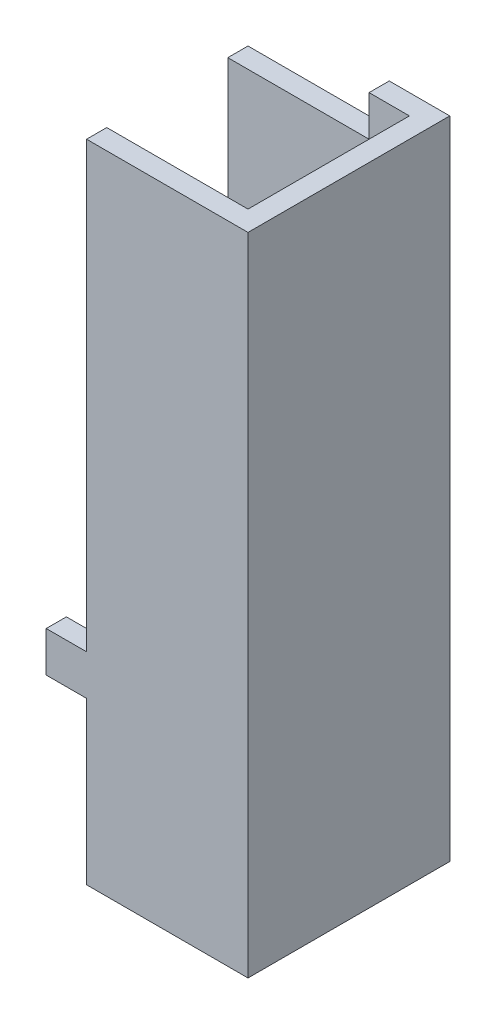
ISO-10303-21;
HEADER;
FILE_DESCRIPTION(('STEP AP214'),'2;1');
FILE_NAME('part.step','',(''),(''),'','','');
FILE_SCHEMA(('AUTOMOTIVE_DESIGN { 1 0 10303 214 1 1 1 1 }'));
ENDSEC;
DATA;
#1=APPLICATION_CONTEXT('core data for automotive mechanical design processes');
#2=APPLICATION_PROTOCOL_DEFINITION('international standard','automotive_design',2000,#1);
#3=PRODUCT_CONTEXT('',#1,'mechanical');
#4=PRODUCT('Part','Part','',(#3));
#5=PRODUCT_RELATED_PRODUCT_CATEGORY('part','',(#4));
#6=PRODUCT_DEFINITION_FORMATION('','',#4);
#7=PRODUCT_DEFINITION_CONTEXT('part definition',#1,'design');
#8=PRODUCT_DEFINITION('design','',#6,#7);
#9=PRODUCT_DEFINITION_SHAPE('','',#8);
#10=(LENGTH_UNIT() NAMED_UNIT(*) SI_UNIT(.MILLI.,.METRE.));
#11=(NAMED_UNIT(*) PLANE_ANGLE_UNIT() SI_UNIT($,.RADIAN.));
#12=(NAMED_UNIT(*) SI_UNIT($,.STERADIAN.) SOLID_ANGLE_UNIT());
#13=UNCERTAINTY_MEASURE_WITH_UNIT(LENGTH_MEASURE(1.E-05),#10,'distance_accuracy_value','');
#14=(GEOMETRIC_REPRESENTATION_CONTEXT(3) GLOBAL_UNCERTAINTY_ASSIGNED_CONTEXT((#13)) GLOBAL_UNIT_ASSIGNED_CONTEXT((#10,
#11,#12)) REPRESENTATION_CONTEXT('',''));
#15=CARTESIAN_POINT('',(0.,0.,0.));
#16=DIRECTION('',(0.,0.,1.));
#17=DIRECTION('',(1.,0.,0.));
#18=AXIS2_PLACEMENT_3D('',#15,#16,#17);
#19=CARTESIAN_POINT('',(-1.6,-0.8,0.));
#20=DIRECTION('',(0.,-1.,0.));
#21=DIRECTION('',(0.,0.,-1.));
#22=AXIS2_PLACEMENT_3D('',#19,#20,#21);
#23=PLANE('',#22);
#24=DIRECTION('',(0.,0.,-1.));
#25=VECTOR('',#24,1.);
#26=CARTESIAN_POINT('',(1.45000000001,-0.80000000001,0.));
#27=LINE('',#26,#25);
#28=CARTESIAN_POINT('',(1.45,-0.8,0.05));
#29=VERTEX_POINT('',#28);
#30=CARTESIAN_POINT('',(1.45,-0.8,0.));
#31=VERTEX_POINT('',#30);
#32=EDGE_CURVE('E229',#29,#31,#27,.T.);
#33=ORIENTED_EDGE('',*,*,#32,.T.);
#34=DIRECTION('',(1.,0.,0.));
#35=VECTOR('',#34,1.);
#36=CARTESIAN_POINT('',(-1.60000000001,-0.80000000001,0.));
#37=LINE('',#36,#35);
#38=CARTESIAN_POINT('',(1.6,-0.8,0.));
#39=VERTEX_POINT('',#38);
#40=EDGE_CURVE('E336',#31,#39,#37,.T.);
#41=ORIENTED_EDGE('',*,*,#40,.T.);
#42=DIRECTION('',(0.,0.,1.));
#43=VECTOR('',#42,1.);
#44=CARTESIAN_POINT('',(1.60000000001,-0.80000000001,0.));
#45=LINE('',#44,#43);
#46=CARTESIAN_POINT('',(1.6,-0.8,0.5));
#47=VERTEX_POINT('',#46);
#48=EDGE_CURVE('E266',#39,#47,#45,.T.);
#49=ORIENTED_EDGE('',*,*,#48,.T.);
#50=DIRECTION('',(1.,0.,0.));
#51=VECTOR('',#50,1.);
#52=CARTESIAN_POINT('',(-1.60000000001,-0.80000000001,0.50000000001));
#53=LINE('',#52,#51);
#54=CARTESIAN_POINT('',(1.2,-0.8,0.5));
#55=VERTEX_POINT('',#54);
#56=EDGE_CURVE('E290',#55,#47,#53,.T.);
#57=ORIENTED_EDGE('',*,*,#56,.F.);
#58=DIRECTION('',(0.,0.,-1.));
#59=VECTOR('',#58,1.);
#60=CARTESIAN_POINT('',(1.20000000001,-0.80000000001,0.25000000001));
#61=LINE('',#60,#59);
#62=CARTESIAN_POINT('',(1.2,-0.8,0.45));
#63=VERTEX_POINT('',#62);
#64=EDGE_CURVE('E319',#55,#63,#61,.T.);
#65=ORIENTED_EDGE('',*,*,#64,.T.);
#66=DIRECTION('',(1.,0.,0.));
#67=VECTOR('',#66,1.);
#68=CARTESIAN_POINT('',(-0.02500000001,-0.80000000001,0.45000000001));
#69=LINE('',#68,#67);
#70=CARTESIAN_POINT('',(1.55,-0.8,0.45));
#71=VERTEX_POINT('',#70);
#72=EDGE_CURVE('E11',#63,#71,#69,.T.);
#73=ORIENTED_EDGE('',*,*,#72,.T.);
#74=DIRECTION('',(0.,0.,-1.));
#75=VECTOR('',#74,1.);
#76=CARTESIAN_POINT('',(1.55000000001,-0.80000000001,0.02500000001));
#77=LINE('',#76,#75);
#78=CARTESIAN_POINT('',(1.55,-0.8,0.05));
#79=VERTEX_POINT('',#78);
#80=EDGE_CURVE('E339',#71,#79,#77,.T.);
#81=ORIENTED_EDGE('',*,*,#80,.T.);
#82=DIRECTION('',(-1.,0.,0.));
#83=VECTOR('',#82,1.);
#84=CARTESIAN_POINT('',(-1.57500000001,-0.80000000001,0.05000000001));
#85=LINE('',#84,#83);
#86=EDGE_CURVE('E262',#79,#29,#85,.T.);
#87=ORIENTED_EDGE('',*,*,#86,.T.);
#88=EDGE_LOOP('',(#33,#41,#49,#57,#65,#73,#81,#87));
#89=FACE_BOUND('',#88,.T.);
#90=ADVANCED_FACE('F17',(#89),#23,.T.);
#91=CARTESIAN_POINT('',(1.1,-0.8,-0.448729564886));
#92=DIRECTION('',(1.,0.,0.));
#93=DIRECTION('',(0.,1.,0.));
#94=AXIS2_PLACEMENT_3D('',#91,#92,#93);
#95=PLANE('',#94);
#96=DIRECTION('',(0.,0.,-1.));
#97=VECTOR('',#96,1.);
#98=CARTESIAN_POINT('',(1.10000000001,-0.30000000001,0.02563521756698));
#99=LINE('',#98,#97);
#100=CARTESIAN_POINT('',(1.1,-0.3,0.5));
#101=VERTEX_POINT('',#100);
#102=CARTESIAN_POINT('',(1.1,-0.3,0.45));
#103=VERTEX_POINT('',#102);
#104=EDGE_CURVE('E217',#101,#103,#99,.T.);
#105=ORIENTED_EDGE('',*,*,#104,.T.);
#106=DIRECTION('',(0.,-1.,0.));
#107=VECTOR('',#106,1.);
#108=CARTESIAN_POINT('',(1.10000000001,-0.80000000001,0.45000000001));
#109=LINE('',#108,#107);
#110=CARTESIAN_POINT('',(1.1,-0.4,0.45));
#111=VERTEX_POINT('',#110);
#112=EDGE_CURVE('E202',#103,#111,#109,.T.);
#113=ORIENTED_EDGE('',*,*,#112,.T.);
#114=DIRECTION('',(0.,0.,1.));
#115=VECTOR('',#114,1.);
#116=CARTESIAN_POINT('',(1.10000000001,-0.40000000001,0.02563521756698));
#117=LINE('',#116,#115);
#118=CARTESIAN_POINT('',(1.1,-0.4,0.5));
#119=VERTEX_POINT('',#118);
#120=EDGE_CURVE('E310',#111,#119,#117,.T.);
#121=ORIENTED_EDGE('',*,*,#120,.T.);
#122=DIRECTION('',(0.,-1.,0.));
#123=VECTOR('',#122,1.);
#124=CARTESIAN_POINT('',(1.10000000001,-0.40000000001,0.50000000001));
#125=LINE('',#124,#123);
#126=EDGE_CURVE('E278',#101,#119,#125,.T.);
#127=ORIENTED_EDGE('',*,*,#126,.F.);
#128=EDGE_LOOP('',(#105,#113,#121,#127));
#129=FACE_BOUND('',#128,.T.);
#130=ADVANCED_FACE('F361',(#129),#95,.F.);
#131=CARTESIAN_POINT('',(1.1,-0.8,-0.448729564886));
#132=DIRECTION('',(1.,0.,0.));
#133=DIRECTION('',(0.,1.,0.));
#134=AXIS2_PLACEMENT_3D('',#131,#132,#133);
#135=PLANE('',#134);
#136=DIRECTION('',(0.,0.,1.));
#137=VECTOR('',#136,1.);
#138=CARTESIAN_POINT('',(1.10000000001,-0.70000000001,-0.224364782453));
#139=LINE('',#138,#137);
#140=CARTESIAN_POINT('',(1.1,-0.7,0.));
#141=VERTEX_POINT('',#140);
#142=CARTESIAN_POINT('',(1.1,-0.7,0.05));
#143=VERTEX_POINT('',#142);
#144=EDGE_CURVE('E239',#141,#143,#139,.T.);
#145=ORIENTED_EDGE('',*,*,#144,.T.);
#146=DIRECTION('',(0.,1.,0.));
#147=VECTOR('',#146,1.);
#148=CARTESIAN_POINT('',(1.10000000001,-0.80000000001,0.05000000001));
#149=LINE('',#148,#147);
#150=CARTESIAN_POINT('',(1.1,0.7,0.05));
#151=VERTEX_POINT('',#150);
#152=EDGE_CURVE('E178',#143,#151,#149,.T.);
#153=ORIENTED_EDGE('',*,*,#152,.T.);
#154=DIRECTION('',(0.,0.,-1.));
#155=VECTOR('',#154,1.);
#156=CARTESIAN_POINT('',(1.10000000001,0.70000000001,-0.224364782453));
#157=LINE('',#156,#155);
#158=CARTESIAN_POINT('',(1.1,0.7,0.));
#159=VERTEX_POINT('',#158);
#160=EDGE_CURVE('E222',#151,#159,#157,.T.);
#161=ORIENTED_EDGE('',*,*,#160,.T.);
#162=DIRECTION('',(0.,1.,0.));
#163=VECTOR('',#162,1.);
#164=CARTESIAN_POINT('',(1.10000000001,-0.40000000001,0.));
#165=LINE('',#164,#163);
#166=EDGE_CURVE('E327',#141,#159,#165,.T.);
#167=ORIENTED_EDGE('',*,*,#166,.F.);
#168=EDGE_LOOP('',(#145,#153,#161,#167));
#169=FACE_BOUND('',#168,.T.);
#170=ADVANCED_FACE('F386',(#169),#135,.F.);
#171=CARTESIAN_POINT('',(1.6,0.8,0.));
#172=DIRECTION('',(0.,1.,0.));
#173=DIRECTION('',(1.,0.,0.));
#174=AXIS2_PLACEMENT_3D('',#171,#172,#173);
#175=PLANE('',#174);
#176=DIRECTION('',(0.,0.,1.));
#177=VECTOR('',#176,1.);
#178=CARTESIAN_POINT('',(1.45000000001,0.80000000001,0.));
#179=LINE('',#178,#177);
#180=CARTESIAN_POINT('',(1.45,0.8,0.));
#181=VERTEX_POINT('',#180);
#182=CARTESIAN_POINT('',(1.45,0.8,0.05));
#183=VERTEX_POINT('',#182);
#184=EDGE_CURVE('E181',#181,#183,#179,.T.);
#185=ORIENTED_EDGE('',*,*,#184,.T.);
#186=DIRECTION('',(1.,0.,0.));
#187=VECTOR('',#186,1.);
#188=CARTESIAN_POINT('',(0.02500000001,0.80000000001,0.05000000001));
#189=LINE('',#188,#187);
#190=CARTESIAN_POINT('',(1.55,0.8,0.05));
#191=VERTEX_POINT('',#190);
#192=EDGE_CURVE('E167',#183,#191,#189,.T.);
#193=ORIENTED_EDGE('',*,*,#192,.T.);
#194=DIRECTION('',(0.,0.,1.));
#195=VECTOR('',#194,1.);
#196=CARTESIAN_POINT('',(1.55000000001,0.80000000001,0.02500000001));
#197=LINE('',#196,#195);
#198=CARTESIAN_POINT('',(1.55,0.8,0.45));
#199=VERTEX_POINT('',#198);
#200=EDGE_CURVE('E330',#191,#199,#197,.T.);
#201=ORIENTED_EDGE('',*,*,#200,.T.);
#202=DIRECTION('',(-1.,0.,0.));
#203=VECTOR('',#202,1.);
#204=CARTESIAN_POINT('',(1.57500000001,0.80000000001,0.45000000001));
#205=LINE('',#204,#203);
#206=CARTESIAN_POINT('',(1.2,0.8,0.45));
#207=VERTEX_POINT('',#206);
#208=EDGE_CURVE('E20',#199,#207,#205,.T.);
#209=ORIENTED_EDGE('',*,*,#208,.T.);
#210=DIRECTION('',(0.,0.,1.));
#211=VECTOR('',#210,1.);
#212=CARTESIAN_POINT('',(1.20000000001,0.80000000001,0.25000000001));
#213=LINE('',#212,#211);
#214=CARTESIAN_POINT('',(1.2,0.8,0.5));
#215=VERTEX_POINT('',#214);
#216=EDGE_CURVE('E259',#207,#215,#213,.T.);
#217=ORIENTED_EDGE('',*,*,#216,.T.);
#218=DIRECTION('',(-1.,0.,0.));
#219=VECTOR('',#218,1.);
#220=CARTESIAN_POINT('',(1.60000000001,0.80000000001,0.50000000001));
#221=LINE('',#220,#219);
#222=CARTESIAN_POINT('',(1.6,0.8,0.5));
#223=VERTEX_POINT('',#222);
#224=EDGE_CURVE('E293',#223,#215,#221,.T.);
#225=ORIENTED_EDGE('',*,*,#224,.F.);
#226=DIRECTION('',(0.,0.,1.));
#227=VECTOR('',#226,1.);
#228=CARTESIAN_POINT('',(1.60000000001,0.80000000001,0.));
#229=LINE('',#228,#227);
#230=CARTESIAN_POINT('',(1.6,0.8,0.));
#231=VERTEX_POINT('',#230);
#232=EDGE_CURVE('E223',#231,#223,#229,.T.);
#233=ORIENTED_EDGE('',*,*,#232,.F.);
#234=DIRECTION('',(-1.,0.,0.));
#235=VECTOR('',#234,1.);
#236=CARTESIAN_POINT('',(1.60000000001,0.80000000001,0.));
#237=LINE('',#236,#235);
#238=EDGE_CURVE('E184',#231,#181,#237,.T.);
#239=ORIENTED_EDGE('',*,*,#238,.T.);
#240=EDGE_LOOP('',(#185,#193,#201,#209,#217,#225,#233,#239));
#241=FACE_BOUND('',#240,.T.);
#242=ADVANCED_FACE('F182',(#241),#175,.T.);
#243=CARTESIAN_POINT('',(1.55,-0.8,0.45));
#244=DIRECTION('',(0.,0.,1.));
#245=DIRECTION('',(1.,0.,0.));
#246=AXIS2_PLACEMENT_3D('',#243,#244,#245);
#247=PLANE('',#246);
#248=DIRECTION('',(0.,1.,0.));
#249=VECTOR('',#248,1.);
#250=CARTESIAN_POINT('',(1.20000000001,-0.60000000001,0.45000000001));
#251=LINE('',#250,#249);
#252=CARTESIAN_POINT('',(1.2,-0.4,0.45));
#253=VERTEX_POINT('',#252);
#254=EDGE_CURVE('E205',#63,#253,#251,.T.);
#255=ORIENTED_EDGE('',*,*,#254,.T.);
#256=DIRECTION('',(-1.,0.,0.));
#257=VECTOR('',#256,1.);
#258=CARTESIAN_POINT('',(1.32500000001,-0.40000000001,0.45000000001));
#259=LINE('',#258,#257);
#260=EDGE_CURVE('E306',#253,#111,#259,.T.);
#261=ORIENTED_EDGE('',*,*,#260,.T.);
#262=ORIENTED_EDGE('',*,*,#112,.F.);
#263=DIRECTION('',(1.,0.,0.));
#264=VECTOR('',#263,1.);
#265=CARTESIAN_POINT('',(1.37500000001,-0.30000000001,0.45000000001));
#266=LINE('',#265,#264);
#267=CARTESIAN_POINT('',(1.2,-0.3,0.45));
#268=VERTEX_POINT('',#267);
#269=EDGE_CURVE('E297',#103,#268,#266,.T.);
#270=ORIENTED_EDGE('',*,*,#269,.T.);
#271=DIRECTION('',(0.,1.,0.));
#272=VECTOR('',#271,1.);
#273=CARTESIAN_POINT('',(1.20000000001,0.,0.45000000001));
#274=LINE('',#273,#272);
#275=EDGE_CURVE('E216',#268,#207,#274,.T.);
#276=ORIENTED_EDGE('',*,*,#275,.T.);
#277=ORIENTED_EDGE('',*,*,#208,.F.);
#278=DIRECTION('',(0.,1.,0.));
#279=VECTOR('',#278,1.);
#280=CARTESIAN_POINT('',(1.55000000001,-0.80000000001,0.45000000001));
#281=LINE('',#280,#279);
#282=EDGE_CURVE('E333',#71,#199,#281,.T.);
#283=ORIENTED_EDGE('',*,*,#282,.F.);
#284=ORIENTED_EDGE('',*,*,#72,.F.);
#285=EDGE_LOOP('',(#255,#261,#262,#270,#276,#277,#283,#284));
#286=FACE_BOUND('',#285,.T.);
#287=ADVANCED_FACE('F348',(#286),#247,.F.);
#288=CARTESIAN_POINT('',(1.55,-0.8,0.05));
#289=DIRECTION('',(1.,0.,0.));
#290=DIRECTION('',(0.,1.,0.));
#291=AXIS2_PLACEMENT_3D('',#288,#289,#290);
#292=PLANE('',#291);
#293=ORIENTED_EDGE('',*,*,#80,.F.);
#294=ORIENTED_EDGE('',*,*,#282,.T.);
#295=ORIENTED_EDGE('',*,*,#200,.F.);
#296=DIRECTION('',(0.,-1.,0.));
#297=VECTOR('',#296,1.);
#298=CARTESIAN_POINT('',(1.55000000001,-0.80000000001,0.05000000001));
#299=LINE('',#298,#297);
#300=EDGE_CURVE('E175',#191,#79,#299,.T.);
#301=ORIENTED_EDGE('',*,*,#300,.T.);
#302=EDGE_LOOP('',(#293,#294,#295,#301));
#303=FACE_BOUND('',#302,.T.);
#304=ADVANCED_FACE('F347',(#303),#292,.F.);
#305=CARTESIAN_POINT('',(0.,0.,0.));
#306=DIRECTION('',(0.,0.,1.));
#307=DIRECTION('',(1.,0.,0.));
#308=AXIS2_PLACEMENT_3D('',#305,#306,#307);
#309=PLANE('',#308);
#310=DIRECTION('',(-1.,0.,0.));
#311=VECTOR('',#310,1.);
#312=CARTESIAN_POINT('',(0.72500000001,-0.70000000001,0.));
#313=LINE('',#312,#311);
#314=CARTESIAN_POINT('',(1.45,-0.7,0.));
#315=VERTEX_POINT('',#314);
#316=EDGE_CURVE('E243',#315,#141,#313,.T.);
#317=ORIENTED_EDGE('',*,*,#316,.T.);
#318=ORIENTED_EDGE('',*,*,#166,.T.);
#319=DIRECTION('',(1.,0.,0.));
#320=VECTOR('',#319,1.);
#321=CARTESIAN_POINT('',(0.55000000001,0.70000000001,0.));
#322=LINE('',#321,#320);
#323=CARTESIAN_POINT('',(1.45,0.7,0.));
#324=VERTEX_POINT('',#323);
#325=EDGE_CURVE('E208',#159,#324,#322,.T.);
#326=ORIENTED_EDGE('',*,*,#325,.T.);
#327=DIRECTION('',(0.,1.,0.));
#328=VECTOR('',#327,1.);
#329=CARTESIAN_POINT('',(1.45000000001,0.35000000001,0.));
#330=LINE('',#329,#328);
#331=EDGE_CURVE('E189',#324,#181,#330,.T.);
#332=ORIENTED_EDGE('',*,*,#331,.T.);
#333=ORIENTED_EDGE('',*,*,#238,.F.);
#334=DIRECTION('',(0.,1.,0.));
#335=VECTOR('',#334,1.);
#336=CARTESIAN_POINT('',(1.60000000001,-0.80000000001,0.));
#337=LINE('',#336,#335);
#338=EDGE_CURVE('E228',#39,#231,#337,.T.);
#339=ORIENTED_EDGE('',*,*,#338,.F.);
#340=ORIENTED_EDGE('',*,*,#40,.F.);
#341=DIRECTION('',(0.,1.,0.));
#342=VECTOR('',#341,1.);
#343=CARTESIAN_POINT('',(1.45000000001,-0.40000000001,0.));
#344=LINE('',#343,#342);
#345=EDGE_CURVE('E234',#31,#315,#344,.T.);
#346=ORIENTED_EDGE('',*,*,#345,.T.);
#347=EDGE_LOOP('',(#317,#318,#326,#332,#333,#339,#340,#346));
#348=FACE_BOUND('',#347,.T.);
#349=ADVANCED_FACE('F377',(#348),#309,.F.);
#350=CARTESIAN_POINT('',(1.1,-0.4,0.5));
#351=DIRECTION('',(0.,1.,0.));
#352=DIRECTION('',(1.,0.,0.));
#353=AXIS2_PLACEMENT_3D('',#350,#351,#352);
#354=PLANE('',#353);
#355=ORIENTED_EDGE('',*,*,#260,.F.);
#356=DIRECTION('',(0.,0.,-1.));
#357=VECTOR('',#356,1.);
#358=CARTESIAN_POINT('',(1.20000000001,-0.40000000001,0.50000000001));
#359=LINE('',#358,#357);
#360=CARTESIAN_POINT('',(1.2,-0.4,0.5));
#361=VERTEX_POINT('',#360);
#362=EDGE_CURVE('E311',#361,#253,#359,.T.);
#363=ORIENTED_EDGE('',*,*,#362,.F.);
#364=DIRECTION('',(1.,0.,0.));
#365=VECTOR('',#364,1.);
#366=CARTESIAN_POINT('',(0.55000000001,-0.40000000001,0.50000000001));
#367=LINE('',#366,#365);
#368=EDGE_CURVE('E282',#119,#361,#367,.T.);
#369=ORIENTED_EDGE('',*,*,#368,.F.);
#370=ORIENTED_EDGE('',*,*,#120,.F.);
#371=EDGE_LOOP('',(#355,#363,#369,#370));
#372=FACE_BOUND('',#371,.T.);
#373=ADVANCED_FACE('F356',(#372),#354,.F.);
#374=CARTESIAN_POINT('',(1.2,-0.4,0.5));
#375=DIRECTION('',(1.,0.,0.));
#376=DIRECTION('',(0.,0.,1.));
#377=AXIS2_PLACEMENT_3D('',#374,#375,#376);
#378=PLANE('',#377);
#379=ORIENTED_EDGE('',*,*,#254,.F.);
#380=ORIENTED_EDGE('',*,*,#64,.F.);
#381=DIRECTION('',(0.,-1.,0.));
#382=VECTOR('',#381,1.);
#383=CARTESIAN_POINT('',(1.20000000001,-0.20000000001,0.50000000001));
#384=LINE('',#383,#382);
#385=EDGE_CURVE('E286',#361,#55,#384,.T.);
#386=ORIENTED_EDGE('',*,*,#385,.F.);
#387=ORIENTED_EDGE('',*,*,#362,.T.);
#388=EDGE_LOOP('',(#379,#380,#386,#387));
#389=FACE_BOUND('',#388,.T.);
#390=ADVANCED_FACE('F353',(#389),#378,.F.);
#391=CARTESIAN_POINT('',(-1.55,-0.8,0.05));
#392=DIRECTION('',(0.,0.,-1.));
#393=DIRECTION('',(0.,-1.,0.));
#394=AXIS2_PLACEMENT_3D('',#391,#392,#393);
#395=PLANE('',#394);
#396=DIRECTION('',(1.,0.,0.));
#397=VECTOR('',#396,1.);
#398=CARTESIAN_POINT('',(-0.05000000001,-0.70000000001,0.05000000001));
#399=LINE('',#398,#397);
#400=CARTESIAN_POINT('',(1.45,-0.7,0.05));
#401=VERTEX_POINT('',#400);
#402=EDGE_CURVE('E233',#143,#401,#399,.T.);
#403=ORIENTED_EDGE('',*,*,#402,.T.);
#404=DIRECTION('',(0.,-1.,0.));
#405=VECTOR('',#404,1.);
#406=CARTESIAN_POINT('',(1.45000000001,-0.80000000001,0.05000000001));
#407=LINE('',#406,#405);
#408=EDGE_CURVE('E238',#401,#29,#407,.T.);
#409=ORIENTED_EDGE('',*,*,#408,.T.);
#410=ORIENTED_EDGE('',*,*,#86,.F.);
#411=ORIENTED_EDGE('',*,*,#300,.F.);
#412=ORIENTED_EDGE('',*,*,#192,.F.);
#413=DIRECTION('',(0.,-1.,0.));
#414=VECTOR('',#413,1.);
#415=CARTESIAN_POINT('',(1.45000000001,-0.05000000001,0.05000000001));
#416=LINE('',#415,#414);
#417=CARTESIAN_POINT('',(1.45,0.7,0.05));
#418=VERTEX_POINT('',#417);
#419=EDGE_CURVE('E172',#183,#418,#416,.T.);
#420=ORIENTED_EDGE('',*,*,#419,.T.);
#421=DIRECTION('',(-1.,0.,0.));
#422=VECTOR('',#421,1.);
#423=CARTESIAN_POINT('',(-0.22500000001,0.70000000001,0.05000000001));
#424=LINE('',#423,#422);
#425=EDGE_CURVE('E206',#418,#151,#424,.T.);
#426=ORIENTED_EDGE('',*,*,#425,.T.);
#427=ORIENTED_EDGE('',*,*,#152,.F.);
#428=EDGE_LOOP('',(#403,#409,#410,#411,#412,#420,#426,#427));
#429=FACE_BOUND('',#428,.T.);
#430=ADVANCED_FACE('F169',(#429),#395,.F.);
#431=CARTESIAN_POINT('',(1.2,0.8,0.5));
#432=DIRECTION('',(1.,0.,0.));
#433=DIRECTION('',(0.,1.,0.));
#434=AXIS2_PLACEMENT_3D('',#431,#432,#433);
#435=PLANE('',#434);
#436=ORIENTED_EDGE('',*,*,#275,.F.);
#437=DIRECTION('',(0.,0.,-1.));
#438=VECTOR('',#437,1.);
#439=CARTESIAN_POINT('',(1.20000000001,-0.30000000001,0.50000000001));
#440=LINE('',#439,#438);
#441=CARTESIAN_POINT('',(1.2,-0.3,0.5));
#442=VERTEX_POINT('',#441);
#443=EDGE_CURVE('E212',#442,#268,#440,.T.);
#444=ORIENTED_EDGE('',*,*,#443,.F.);
#445=DIRECTION('',(0.,-1.,0.));
#446=VECTOR('',#445,1.);
#447=CARTESIAN_POINT('',(1.20000000001,0.40000000001,0.50000000001));
#448=LINE('',#447,#446);
#449=EDGE_CURVE('E270',#215,#442,#448,.T.);
#450=ORIENTED_EDGE('',*,*,#449,.F.);
#451=ORIENTED_EDGE('',*,*,#216,.F.);
#452=EDGE_LOOP('',(#436,#444,#450,#451));
#453=FACE_BOUND('',#452,.T.);
#454=ADVANCED_FACE('F367',(#453),#435,.F.);
#455=CARTESIAN_POINT('',(1.2,-0.3,0.5));
#456=DIRECTION('',(0.,-1.,0.));
#457=DIRECTION('',(0.,0.,-1.));
#458=AXIS2_PLACEMENT_3D('',#455,#456,#457);
#459=PLANE('',#458);
#460=ORIENTED_EDGE('',*,*,#269,.F.);
#461=ORIENTED_EDGE('',*,*,#104,.F.);
#462=DIRECTION('',(-1.,0.,0.));
#463=VECTOR('',#462,1.);
#464=CARTESIAN_POINT('',(0.60000000001,-0.30000000001,0.50000000001));
#465=LINE('',#464,#463);
#466=EDGE_CURVE('E274',#442,#101,#465,.T.);
#467=ORIENTED_EDGE('',*,*,#466,.F.);
#468=ORIENTED_EDGE('',*,*,#443,.T.);
#469=EDGE_LOOP('',(#460,#461,#467,#468));
#470=FACE_BOUND('',#469,.T.);
#471=ADVANCED_FACE('F364',(#470),#459,.F.);
#472=CARTESIAN_POINT('',(0.,0.,0.5));
#473=DIRECTION('',(0.,0.,1.));
#474=DIRECTION('',(1.,0.,0.));
#475=AXIS2_PLACEMENT_3D('',#472,#473,#474);
#476=PLANE('',#475);
#477=ORIENTED_EDGE('',*,*,#449,.T.);
#478=ORIENTED_EDGE('',*,*,#466,.T.);
#479=ORIENTED_EDGE('',*,*,#126,.T.);
#480=ORIENTED_EDGE('',*,*,#368,.T.);
#481=ORIENTED_EDGE('',*,*,#385,.T.);
#482=ORIENTED_EDGE('',*,*,#56,.T.);
#483=DIRECTION('',(0.,1.,0.));
#484=VECTOR('',#483,1.);
#485=CARTESIAN_POINT('',(1.60000000001,-0.80000000001,0.50000000001));
#486=LINE('',#485,#484);
#487=EDGE_CURVE('E227',#47,#223,#486,.T.);
#488=ORIENTED_EDGE('',*,*,#487,.T.);
#489=ORIENTED_EDGE('',*,*,#224,.T.);
#490=EDGE_LOOP('',(#477,#478,#479,#480,#481,#482,#488,#489));
#491=FACE_BOUND('',#490,.T.);
#492=ADVANCED_FACE('F370',(#491),#476,.T.);
#493=CARTESIAN_POINT('',(1.6,-0.8,0.));
#494=DIRECTION('',(1.,0.,0.));
#495=DIRECTION('',(0.,1.,0.));
#496=AXIS2_PLACEMENT_3D('',#493,#494,#495);
#497=PLANE('',#496);
#498=ORIENTED_EDGE('',*,*,#338,.T.);
#499=ORIENTED_EDGE('',*,*,#232,.T.);
#500=ORIENTED_EDGE('',*,*,#487,.F.);
#501=ORIENTED_EDGE('',*,*,#48,.F.);
#502=EDGE_LOOP('',(#498,#499,#500,#501));
#503=FACE_BOUND('',#502,.T.);
#504=ADVANCED_FACE('F374',(#503),#497,.T.);
#505=CARTESIAN_POINT('',(1.45,-0.7,0.));
#506=DIRECTION('',(0.,1.,0.));
#507=DIRECTION('',(1.,0.,0.));
#508=AXIS2_PLACEMENT_3D('',#505,#506,#507);
#509=PLANE('',#508);
#510=ORIENTED_EDGE('',*,*,#402,.F.);
#511=ORIENTED_EDGE('',*,*,#144,.F.);
#512=ORIENTED_EDGE('',*,*,#316,.F.);
#513=DIRECTION('',(0.,0.,1.));
#514=VECTOR('',#513,1.);
#515=CARTESIAN_POINT('',(1.45000000001,-0.70000000001,0.));
#516=LINE('',#515,#514);
#517=EDGE_CURVE('E247',#315,#401,#516,.T.);
#518=ORIENTED_EDGE('',*,*,#517,.T.);
#519=EDGE_LOOP('',(#510,#511,#512,#518));
#520=FACE_BOUND('',#519,.T.);
#521=ADVANCED_FACE('F388',(#520),#509,.F.);
#522=CARTESIAN_POINT('',(1.45,-0.8,0.));
#523=DIRECTION('',(1.,0.,0.));
#524=DIRECTION('',(0.,1.,0.));
#525=AXIS2_PLACEMENT_3D('',#522,#523,#524);
#526=PLANE('',#525);
#527=ORIENTED_EDGE('',*,*,#408,.F.);
#528=ORIENTED_EDGE('',*,*,#517,.F.);
#529=ORIENTED_EDGE('',*,*,#345,.F.);
#530=ORIENTED_EDGE('',*,*,#32,.F.);
#531=EDGE_LOOP('',(#527,#528,#529,#530));
#532=FACE_BOUND('',#531,.T.);
#533=ADVANCED_FACE('F395',(#532),#526,.F.);
#534=CARTESIAN_POINT('',(1.1,0.7,0.));
#535=DIRECTION('',(0.,-1.,0.));
#536=DIRECTION('',(0.,0.,-1.));
#537=AXIS2_PLACEMENT_3D('',#534,#535,#536);
#538=PLANE('',#537);
#539=ORIENTED_EDGE('',*,*,#425,.F.);
#540=DIRECTION('',(0.,0.,1.));
#541=VECTOR('',#540,1.);
#542=CARTESIAN_POINT('',(1.45000000001,0.70000000001,0.));
#543=LINE('',#542,#541);
#544=EDGE_CURVE('E194',#324,#418,#543,.T.);
#545=ORIENTED_EDGE('',*,*,#544,.F.);
#546=ORIENTED_EDGE('',*,*,#325,.F.);
#547=ORIENTED_EDGE('',*,*,#160,.F.);
#548=EDGE_LOOP('',(#539,#545,#546,#547));
#549=FACE_BOUND('',#548,.T.);
#550=ADVANCED_FACE('F381',(#549),#538,.F.);
#551=CARTESIAN_POINT('',(1.45,0.7,0.));
#552=DIRECTION('',(1.,0.,0.));
#553=DIRECTION('',(0.,1.,0.));
#554=AXIS2_PLACEMENT_3D('',#551,#552,#553);
#555=PLANE('',#554);
#556=ORIENTED_EDGE('',*,*,#419,.F.);
#557=ORIENTED_EDGE('',*,*,#184,.F.);
#558=ORIENTED_EDGE('',*,*,#331,.F.);
#559=ORIENTED_EDGE('',*,*,#544,.T.);
#560=EDGE_LOOP('',(#556,#557,#558,#559));
#561=FACE_BOUND('',#560,.T.);
#562=ADVANCED_FACE('F192',(#561),#555,.F.);
#563=CLOSED_SHELL('',(#90,#130,#170,#242,#287,#304,#349,#373,#390,#430,#454,#471,#492,#504,#521,
#533,#550,#562));
#564=MANIFOLD_SOLID_BREP('B1',#563);
#565=ADVANCED_BREP_SHAPE_REPRESENTATION('',(#18,#564),#14);
#566=SHAPE_DEFINITION_REPRESENTATION(#9,#565);
ENDSEC;
END-ISO-10303-21;
